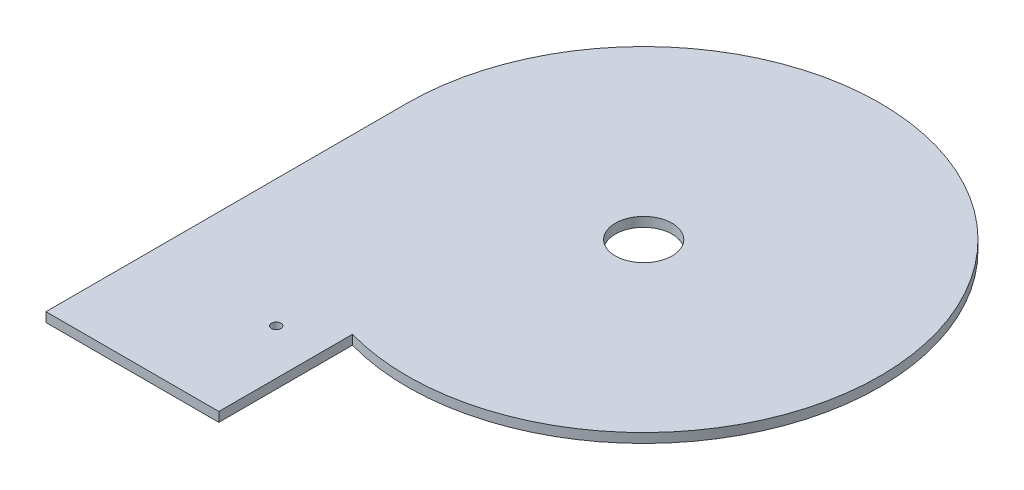
ISO-10303-21;
HEADER;
FILE_DESCRIPTION(('STEP AP214'),'2;1');
FILE_NAME('part.step','',(''),(''),'','','');
FILE_SCHEMA(('AUTOMOTIVE_DESIGN { 1 0 10303 214 1 1 1 1 }'));
ENDSEC;
DATA;
#1=APPLICATION_CONTEXT('core data for automotive mechanical design processes');
#2=APPLICATION_PROTOCOL_DEFINITION('international standard','automotive_design',2000,#1);
#3=PRODUCT_CONTEXT('',#1,'mechanical');
#4=PRODUCT('Part','Part','',(#3));
#5=PRODUCT_RELATED_PRODUCT_CATEGORY('part','',(#4));
#6=PRODUCT_DEFINITION_FORMATION('','',#4);
#7=PRODUCT_DEFINITION_CONTEXT('part definition',#1,'design');
#8=PRODUCT_DEFINITION('design','',#6,#7);
#9=PRODUCT_DEFINITION_SHAPE('','',#8);
#10=(LENGTH_UNIT() NAMED_UNIT(*) SI_UNIT(.MILLI.,.METRE.));
#11=(NAMED_UNIT(*) PLANE_ANGLE_UNIT() SI_UNIT($,.RADIAN.));
#12=(NAMED_UNIT(*) SI_UNIT($,.STERADIAN.) SOLID_ANGLE_UNIT());
#13=UNCERTAINTY_MEASURE_WITH_UNIT(LENGTH_MEASURE(1.E-05),#10,'distance_accuracy_value','');
#14=(GEOMETRIC_REPRESENTATION_CONTEXT(3) GLOBAL_UNCERTAINTY_ASSIGNED_CONTEXT((#13)) GLOBAL_UNIT_ASSIGNED_CONTEXT((#10,
#11,#12)) REPRESENTATION_CONTEXT('',''));
#15=CARTESIAN_POINT('',(0.,0.,0.));
#16=DIRECTION('',(0.,0.,1.));
#17=DIRECTION('',(1.,0.,0.));
#18=AXIS2_PLACEMENT_3D('',#15,#16,#17);
#19=CARTESIAN_POINT('',(0.,2.,0.));
#20=DIRECTION('',(0.,-1.,0.));
#21=DIRECTION('',(0.,0.,-1.));
#22=AXIS2_PLACEMENT_3D('',#19,#20,#21);
#23=CYLINDRICAL_SURFACE('',#22,50.);
#24=CARTESIAN_POINT('',(0.,2.,0.));
#25=DIRECTION('',(0.,1.,0.));
#26=DIRECTION('',(0.,0.,1.));
#27=AXIS2_PLACEMENT_3D('',#24,#25,#26);
#28=CIRCLE('',#27,50.);
#29=CARTESIAN_POINT('',(-13.4444611593696,2.,48.1585554614567));
#30=VERTEX_POINT('',#29);
#31=CARTESIAN_POINT('',(-50.,2.,0.));
#32=VERTEX_POINT('',#31);
#33=EDGE_CURVE('E11',#30,#32,#28,.T.);
#34=ORIENTED_EDGE('',*,*,#33,.F.);
#35=DIRECTION('',(0.,-1.,0.));
#36=VECTOR('',#35,1.);
#37=CARTESIAN_POINT('',(-13.4444611593696,2.,48.1585554614567));
#38=LINE('',#37,#36);
#39=CARTESIAN_POINT('',(-13.4444611593696,0.,48.1585554614567));
#40=VERTEX_POINT('',#39);
#41=EDGE_CURVE('E86',#30,#40,#38,.T.);
#42=ORIENTED_EDGE('',*,*,#41,.T.);
#43=CARTESIAN_POINT('',(0.,0.,0.));
#44=DIRECTION('',(0.,1.,0.));
#45=DIRECTION('',(0.,0.,1.));
#46=AXIS2_PLACEMENT_3D('',#43,#44,#45);
#47=CIRCLE('',#46,50.);
#48=CARTESIAN_POINT('',(-50.,0.,0.));
#49=VERTEX_POINT('',#48);
#50=EDGE_CURVE('E46',#40,#49,#47,.T.);
#51=ORIENTED_EDGE('',*,*,#50,.T.);
#52=DIRECTION('',(0.,-1.,0.));
#53=VECTOR('',#52,1.);
#54=CARTESIAN_POINT('',(-50.,2.,0.));
#55=LINE('',#54,#53);
#56=EDGE_CURVE('E60',#32,#49,#55,.T.);
#57=ORIENTED_EDGE('',*,*,#56,.F.);
#58=EDGE_LOOP('',(#34,#42,#51,#57));
#59=FACE_BOUND('',#58,.T.);
#60=ADVANCED_FACE('F43',(#59),#23,.T.);
#61=CARTESIAN_POINT('',(0.,2.,0.));
#62=DIRECTION('',(0.,1.,0.));
#63=DIRECTION('',(0.,0.,1.));
#64=AXIS2_PLACEMENT_3D('',#61,#62,#63);
#65=PLANE('',#64);
#66=CARTESIAN_POINT('',(-23.0500000000117,2.,54.680000000004));
#67=DIRECTION('',(0.,1.,0.));
#68=DIRECTION('',(0.,0.,1.));
#69=AXIS2_PLACEMENT_3D('',#66,#67,#68);
#70=CIRCLE('',#69,1.);
#71=CARTESIAN_POINT('',(-23.0500000000117,2.,55.680000000004));
#72=VERTEX_POINT('',#71);
#73=EDGE_CURVE('E153',#72,#72,#70,.F.);
#74=ORIENTED_EDGE('',*,*,#73,.T.);
#75=EDGE_LOOP('',(#74));
#76=FACE_BOUND('',#75,.T.);
#77=ORIENTED_EDGE('',*,*,#33,.T.);
#78=DIRECTION('',(0.,0.,-1.));
#79=VECTOR('',#78,1.);
#80=CARTESIAN_POINT('',(-50.,2.,0.));
#81=LINE('',#80,#79);
#82=CARTESIAN_POINT('',(-50.,2.,76.4199488391967));
#83=VERTEX_POINT('',#82);
#84=EDGE_CURVE('E90',#83,#32,#81,.T.);
#85=ORIENTED_EDGE('',*,*,#84,.F.);
#86=DIRECTION('',(-1.,0.,0.));
#87=VECTOR('',#86,1.);
#88=CARTESIAN_POINT('',(-50.,2.,76.4199488391967));
#89=LINE('',#88,#87);
#90=CARTESIAN_POINT('',(-13.4444611593696,2.,76.4199488391967));
#91=VERTEX_POINT('',#90);
#92=EDGE_CURVE('E89',#91,#83,#89,.T.);
#93=ORIENTED_EDGE('',*,*,#92,.F.);
#94=DIRECTION('',(0.,0.,1.));
#95=VECTOR('',#94,1.);
#96=CARTESIAN_POINT('',(-13.4444611593696,2.,0.));
#97=LINE('',#96,#95);
#98=EDGE_CURVE('E80',#30,#91,#97,.T.);
#99=ORIENTED_EDGE('',*,*,#98,.F.);
#100=EDGE_LOOP('',(#77,#85,#93,#99));
#101=FACE_BOUND('',#100,.T.);
#102=CARTESIAN_POINT('',(0.,2.,0.));
#103=DIRECTION('',(0.,1.,0.));
#104=DIRECTION('',(0.,0.,1.));
#105=AXIS2_PLACEMENT_3D('',#102,#103,#104);
#106=CIRCLE('',#105,6.);
#107=CARTESIAN_POINT('',(0.,2.,6.));
#108=VERTEX_POINT('',#107);
#109=EDGE_CURVE('E116',#108,#108,#106,.T.);
#110=ORIENTED_EDGE('',*,*,#109,.F.);
#111=EDGE_LOOP('',(#110));
#112=FACE_BOUND('',#111,.T.);
#113=ADVANCED_FACE('F100',(#76,#101,#112),#65,.T.);
#114=CARTESIAN_POINT('',(0.,0.,0.));
#115=DIRECTION('',(0.,1.,0.));
#116=DIRECTION('',(0.,0.,1.));
#117=AXIS2_PLACEMENT_3D('',#114,#115,#116);
#118=PLANE('',#117);
#119=CARTESIAN_POINT('',(-23.0500000000117,0.,54.680000000004));
#120=DIRECTION('',(0.,-1.,0.));
#121=DIRECTION('',(0.,0.,-1.));
#122=AXIS2_PLACEMENT_3D('',#119,#120,#121);
#123=CIRCLE('',#122,1.);
#124=CARTESIAN_POINT('',(-23.0500000000117,0.,53.680000000004));
#125=VERTEX_POINT('',#124);
#126=EDGE_CURVE('E111',#125,#125,#123,.T.);
#127=ORIENTED_EDGE('',*,*,#126,.F.);
#128=EDGE_LOOP('',(#127));
#129=FACE_BOUND('',#128,.T.);
#130=CARTESIAN_POINT('',(0.,0.,0.));
#131=DIRECTION('',(0.,1.,0.));
#132=DIRECTION('',(0.,0.,1.));
#133=AXIS2_PLACEMENT_3D('',#130,#131,#132);
#134=CIRCLE('',#133,6.);
#135=CARTESIAN_POINT('',(0.,0.,6.));
#136=VERTEX_POINT('',#135);
#137=EDGE_CURVE('E117',#136,#136,#134,.T.);
#138=ORIENTED_EDGE('',*,*,#137,.T.);
#139=EDGE_LOOP('',(#138));
#140=FACE_BOUND('',#139,.T.);
#141=ORIENTED_EDGE('',*,*,#50,.F.);
#142=DIRECTION('',(0.,0.,1.));
#143=VECTOR('',#142,1.);
#144=CARTESIAN_POINT('',(-13.4444611593696,0.,0.));
#145=LINE('',#144,#143);
#146=CARTESIAN_POINT('',(-13.4444611593696,0.,76.4199488391967));
#147=VERTEX_POINT('',#146);
#148=EDGE_CURVE('E110',#40,#147,#145,.T.);
#149=ORIENTED_EDGE('',*,*,#148,.T.);
#150=DIRECTION('',(-1.,0.,0.));
#151=VECTOR('',#150,1.);
#152=CARTESIAN_POINT('',(-50.,0.,76.4199488391967));
#153=LINE('',#152,#151);
#154=CARTESIAN_POINT('',(-50.,0.,76.4199488391967));
#155=VERTEX_POINT('',#154);
#156=EDGE_CURVE('E96',#147,#155,#153,.T.);
#157=ORIENTED_EDGE('',*,*,#156,.T.);
#158=DIRECTION('',(0.,0.,-1.));
#159=VECTOR('',#158,1.);
#160=CARTESIAN_POINT('',(-50.,0.,0.));
#161=LINE('',#160,#159);
#162=EDGE_CURVE('E107',#155,#49,#161,.T.);
#163=ORIENTED_EDGE('',*,*,#162,.T.);
#164=EDGE_LOOP('',(#141,#149,#157,#163));
#165=FACE_BOUND('',#164,.T.);
#166=ADVANCED_FACE('F125',(#129,#140,#165),#118,.F.);
#167=CARTESIAN_POINT('',(0.,0.,0.));
#168=DIRECTION('',(0.,1.,0.));
#169=DIRECTION('',(0.,0.,1.));
#170=AXIS2_PLACEMENT_3D('',#167,#168,#169);
#171=CYLINDRICAL_SURFACE('',#170,6.);
#172=ORIENTED_EDGE('',*,*,#137,.F.);
#173=EDGE_LOOP('',(#172));
#174=FACE_BOUND('',#173,.T.);
#175=ORIENTED_EDGE('',*,*,#109,.T.);
#176=EDGE_LOOP('',(#175));
#177=FACE_BOUND('',#176,.T.);
#178=ADVANCED_FACE('F123',(#174,#177),#171,.F.);
#179=CARTESIAN_POINT('',(-13.4444611593696,2.,0.));
#180=DIRECTION('',(1.,0.,0.));
#181=DIRECTION('',(0.,0.,-1.));
#182=AXIS2_PLACEMENT_3D('',#179,#180,#181);
#183=PLANE('',#182);
#184=ORIENTED_EDGE('',*,*,#41,.F.);
#185=ORIENTED_EDGE('',*,*,#98,.T.);
#186=DIRECTION('',(0.,-1.,0.));
#187=VECTOR('',#186,1.);
#188=CARTESIAN_POINT('',(-13.4444611593696,2.,76.4199488391967));
#189=LINE('',#188,#187);
#190=EDGE_CURVE('E84',#91,#147,#189,.T.);
#191=ORIENTED_EDGE('',*,*,#190,.T.);
#192=ORIENTED_EDGE('',*,*,#148,.F.);
#193=EDGE_LOOP('',(#184,#185,#191,#192));
#194=FACE_BOUND('',#193,.T.);
#195=ADVANCED_FACE('F82',(#194),#183,.T.);
#196=CARTESIAN_POINT('',(-50.,2.,0.));
#197=DIRECTION('',(-1.,0.,0.));
#198=DIRECTION('',(0.,0.,1.));
#199=AXIS2_PLACEMENT_3D('',#196,#197,#198);
#200=PLANE('',#199);
#201=ORIENTED_EDGE('',*,*,#162,.F.);
#202=DIRECTION('',(0.,-1.,0.));
#203=VECTOR('',#202,1.);
#204=CARTESIAN_POINT('',(-50.,2.,76.4199488391967));
#205=LINE('',#204,#203);
#206=EDGE_CURVE('E97',#83,#155,#205,.T.);
#207=ORIENTED_EDGE('',*,*,#206,.F.);
#208=ORIENTED_EDGE('',*,*,#84,.T.);
#209=ORIENTED_EDGE('',*,*,#56,.T.);
#210=EDGE_LOOP('',(#201,#207,#208,#209));
#211=FACE_BOUND('',#210,.T.);
#212=ADVANCED_FACE('F139',(#211),#200,.T.);
#213=CARTESIAN_POINT('',(-50.,2.,76.4199488391967));
#214=DIRECTION('',(0.,0.,1.));
#215=DIRECTION('',(1.,0.,0.));
#216=AXIS2_PLACEMENT_3D('',#213,#214,#215);
#217=PLANE('',#216);
#218=ORIENTED_EDGE('',*,*,#156,.F.);
#219=ORIENTED_EDGE('',*,*,#190,.F.);
#220=ORIENTED_EDGE('',*,*,#92,.T.);
#221=ORIENTED_EDGE('',*,*,#206,.T.);
#222=EDGE_LOOP('',(#218,#219,#220,#221));
#223=FACE_BOUND('',#222,.T.);
#224=ADVANCED_FACE('F94',(#223),#217,.T.);
#225=CARTESIAN_POINT('',(-23.0500000000117,2.001,54.680000000004));
#226=DIRECTION('',(0.,-1.,0.));
#227=DIRECTION('',(0.,0.,-1.));
#228=AXIS2_PLACEMENT_3D('',#225,#226,#227);
#229=CYLINDRICAL_SURFACE('',#228,1.);
#230=ORIENTED_EDGE('',*,*,#73,.F.);
#231=EDGE_LOOP('',(#230));
#232=FACE_BOUND('',#231,.T.);
#233=ORIENTED_EDGE('',*,*,#126,.T.);
#234=EDGE_LOOP('',(#233));
#235=FACE_BOUND('',#234,.T.);
#236=ADVANCED_FACE('F146',(#232,#235),#229,.F.);
#237=CLOSED_SHELL('',(#60,#113,#166,#178,#195,#212,#224,#236));
#238=MANIFOLD_SOLID_BREP('B2',#237);
#239=ADVANCED_BREP_SHAPE_REPRESENTATION('',(#18,#238),#14);
#240=SHAPE_DEFINITION_REPRESENTATION(#9,#239);
ENDSEC;
END-ISO-10303-21;
